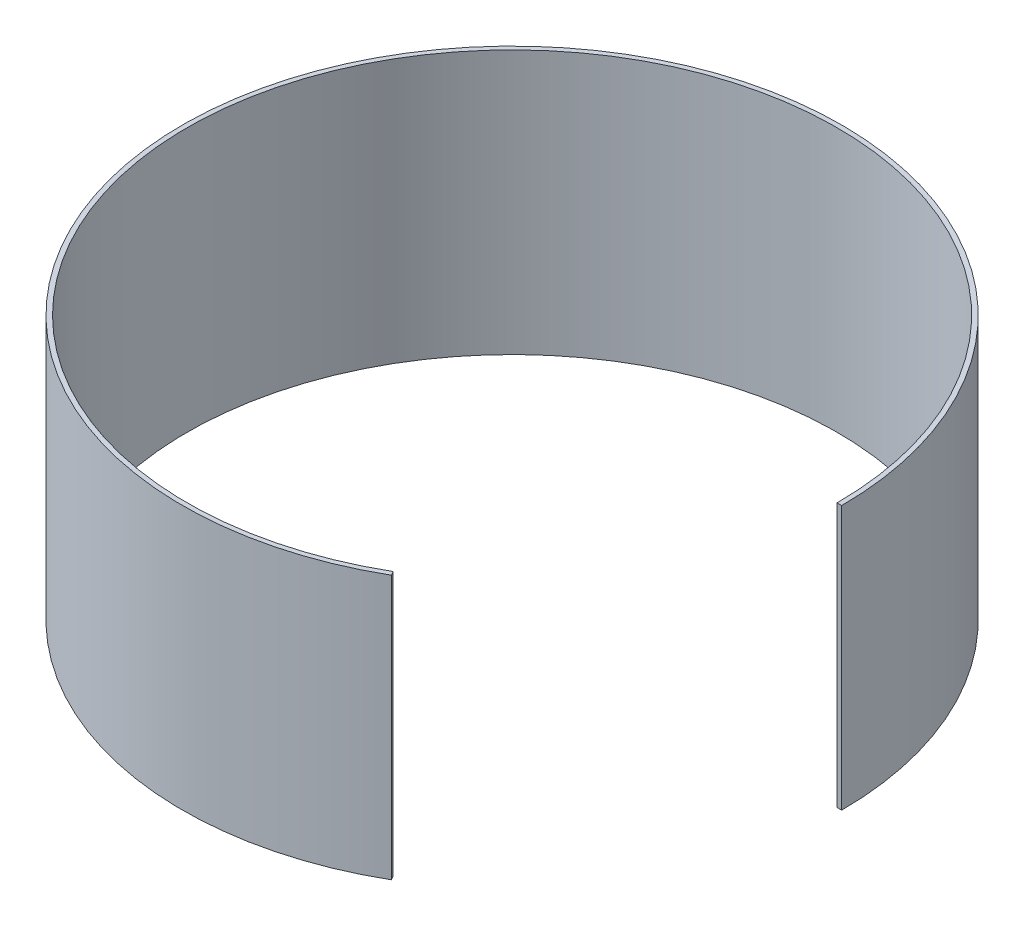
ISO-10303-21;
HEADER;
FILE_DESCRIPTION(('STEP AP214'),'2;1');
FILE_NAME('part.step','',(''),(''),'','','');
FILE_SCHEMA(('AUTOMOTIVE_DESIGN { 1 0 10303 214 1 1 1 1 }'));
ENDSEC;
DATA;
#1=APPLICATION_CONTEXT('core data for automotive mechanical design processes');
#2=APPLICATION_PROTOCOL_DEFINITION('international standard','automotive_design',2000,#1);
#3=PRODUCT_CONTEXT('',#1,'mechanical');
#4=PRODUCT('Part','Part','',(#3));
#5=PRODUCT_RELATED_PRODUCT_CATEGORY('part','',(#4));
#6=PRODUCT_DEFINITION_FORMATION('','',#4);
#7=PRODUCT_DEFINITION_CONTEXT('part definition',#1,'design');
#8=PRODUCT_DEFINITION('design','',#6,#7);
#9=PRODUCT_DEFINITION_SHAPE('','',#8);
#10=(LENGTH_UNIT() NAMED_UNIT(*) SI_UNIT(.MILLI.,.METRE.));
#11=(NAMED_UNIT(*) PLANE_ANGLE_UNIT() SI_UNIT($,.RADIAN.));
#12=(NAMED_UNIT(*) SI_UNIT($,.STERADIAN.) SOLID_ANGLE_UNIT());
#13=UNCERTAINTY_MEASURE_WITH_UNIT(LENGTH_MEASURE(1.E-05),#10,'distance_accuracy_value','');
#14=(GEOMETRIC_REPRESENTATION_CONTEXT(3) GLOBAL_UNCERTAINTY_ASSIGNED_CONTEXT((#13)) GLOBAL_UNIT_ASSIGNED_CONTEXT((#10,
#11,#12)) REPRESENTATION_CONTEXT('',''));
#15=CARTESIAN_POINT('',(0.,0.,0.));
#16=DIRECTION('',(0.,0.,1.));
#17=DIRECTION('',(1.,0.,0.));
#18=AXIS2_PLACEMENT_3D('',#15,#16,#17);
#19=CARTESIAN_POINT('',(0.,0.,0.));
#20=DIRECTION('',(0.,-1.,0.));
#21=DIRECTION('',(0.,0.,-1.));
#22=AXIS2_PLACEMENT_3D('',#19,#20,#21);
#23=CYLINDRICAL_SURFACE('',#22,420.);
#24=CARTESIAN_POINT('',(0.,341.,0.));
#25=DIRECTION('',(0.,-1.,0.));
#26=DIRECTION('',(0.,0.,-1.));
#27=AXIS2_PLACEMENT_3D('',#24,#25,#26);
#28=CIRCLE('',#27,420.);
#29=CARTESIAN_POINT('',(210.000000000004,341.,363.730669589462));
#30=VERTEX_POINT('',#29);
#31=CARTESIAN_POINT('',(420.,341.,0.));
#32=VERTEX_POINT('',#31);
#33=EDGE_CURVE('E11',#30,#32,#28,.T.);
#34=ORIENTED_EDGE('',*,*,#33,.F.);
#35=DIRECTION('',(0.,-1.,0.));
#36=VECTOR('',#35,1.);
#37=CARTESIAN_POINT('',(210.000000000004,341.,363.730669589462));
#38=LINE('',#37,#36);
#39=CARTESIAN_POINT('',(210.000000000004,0.,363.730669589462));
#40=VERTEX_POINT('',#39);
#41=EDGE_CURVE('E73',#30,#40,#38,.T.);
#42=ORIENTED_EDGE('',*,*,#41,.T.);
#43=CARTESIAN_POINT('',(0.,0.,0.));
#44=DIRECTION('',(0.,-1.,0.));
#45=DIRECTION('',(0.,0.,-1.));
#46=AXIS2_PLACEMENT_3D('',#43,#44,#45);
#47=CIRCLE('',#46,420.);
#48=CARTESIAN_POINT('',(420.,0.,0.));
#49=VERTEX_POINT('',#48);
#50=EDGE_CURVE('E68',#40,#49,#47,.T.);
#51=ORIENTED_EDGE('',*,*,#50,.T.);
#52=DIRECTION('',(0.,-1.,0.));
#53=VECTOR('',#52,1.);
#54=CARTESIAN_POINT('',(420.,341.,0.));
#55=LINE('',#54,#53);
#56=EDGE_CURVE('E71',#32,#49,#55,.T.);
#57=ORIENTED_EDGE('',*,*,#56,.F.);
#58=EDGE_LOOP('',(#34,#42,#51,#57));
#59=FACE_BOUND('',#58,.T.);
#60=ADVANCED_FACE('F32',(#59),#23,.F.);
#61=CARTESIAN_POINT('',(213.000000000004,341.,368.926822012168));
#62=DIRECTION('',(0.,1.,0.));
#63=DIRECTION('',(0.,0.,1.));
#64=AXIS2_PLACEMENT_3D('',#61,#62,#63);
#65=PLANE('',#64);
#66=CARTESIAN_POINT('',(0.,341.,0.));
#67=DIRECTION('',(0.,-1.,0.));
#68=DIRECTION('',(0.,0.,-1.));
#69=AXIS2_PLACEMENT_3D('',#66,#67,#68);
#70=CIRCLE('',#69,426.);
#71=CARTESIAN_POINT('',(213.000000000004,341.,368.926822012168));
#72=VERTEX_POINT('',#71);
#73=CARTESIAN_POINT('',(426.,341.,0.));
#74=VERTEX_POINT('',#73);
#75=EDGE_CURVE('E40',#72,#74,#70,.T.);
#76=ORIENTED_EDGE('',*,*,#75,.F.);
#77=DIRECTION('',(-0.50000000000001,0.,-0.866025403784433));
#78=VECTOR('',#77,1.);
#79=CARTESIAN_POINT('',(213.000000000004,341.,368.926822012168));
#80=LINE('',#79,#78);
#81=EDGE_CURVE('E78',#72,#30,#80,.T.);
#82=ORIENTED_EDGE('',*,*,#81,.T.);
#83=ORIENTED_EDGE('',*,*,#33,.T.);
#84=DIRECTION('',(-1.,0.,0.));
#85=VECTOR('',#84,1.);
#86=CARTESIAN_POINT('',(426.,341.,0.));
#87=LINE('',#86,#85);
#88=EDGE_CURVE('E90',#74,#32,#87,.T.);
#89=ORIENTED_EDGE('',*,*,#88,.F.);
#90=EDGE_LOOP('',(#76,#82,#83,#89));
#91=FACE_BOUND('',#90,.T.);
#92=ADVANCED_FACE('F34',(#91),#65,.T.);
#93=CARTESIAN_POINT('',(0.,0.,0.));
#94=DIRECTION('',(0.,-1.,0.));
#95=DIRECTION('',(0.,0.,-1.));
#96=AXIS2_PLACEMENT_3D('',#93,#94,#95);
#97=CYLINDRICAL_SURFACE('',#96,426.);
#98=CARTESIAN_POINT('',(0.,0.,0.));
#99=DIRECTION('',(0.,-1.,0.));
#100=DIRECTION('',(0.,0.,-1.));
#101=AXIS2_PLACEMENT_3D('',#98,#99,#100);
#102=CIRCLE('',#101,426.);
#103=CARTESIAN_POINT('',(213.000000000004,0.,368.926822012168));
#104=VERTEX_POINT('',#103);
#105=CARTESIAN_POINT('',(426.,0.,0.));
#106=VERTEX_POINT('',#105);
#107=EDGE_CURVE('E77',#104,#106,#102,.T.);
#108=ORIENTED_EDGE('',*,*,#107,.F.);
#109=DIRECTION('',(0.,1.,0.));
#110=VECTOR('',#109,1.);
#111=CARTESIAN_POINT('',(213.000000000004,341.,368.926822012168));
#112=LINE('',#111,#110);
#113=EDGE_CURVE('E98',#104,#72,#112,.T.);
#114=ORIENTED_EDGE('',*,*,#113,.T.);
#115=ORIENTED_EDGE('',*,*,#75,.T.);
#116=DIRECTION('',(0.,1.,0.));
#117=VECTOR('',#116,1.);
#118=CARTESIAN_POINT('',(426.,341.,0.));
#119=LINE('',#118,#117);
#120=EDGE_CURVE('E86',#106,#74,#119,.T.);
#121=ORIENTED_EDGE('',*,*,#120,.F.);
#122=EDGE_LOOP('',(#108,#114,#115,#121));
#123=FACE_BOUND('',#122,.T.);
#124=ADVANCED_FACE('F102',(#123),#97,.T.);
#125=CARTESIAN_POINT('',(213.000000000004,0.,368.926822012168));
#126=DIRECTION('',(0.,-1.,0.));
#127=DIRECTION('',(0.,0.,-1.));
#128=AXIS2_PLACEMENT_3D('',#125,#126,#127);
#129=PLANE('',#128);
#130=DIRECTION('',(0.50000000000001,0.,0.866025403784433));
#131=VECTOR('',#130,1.);
#132=CARTESIAN_POINT('',(213.000000000004,0.,368.926822012168));
#133=LINE('',#132,#131);
#134=EDGE_CURVE('E96',#40,#104,#133,.T.);
#135=ORIENTED_EDGE('',*,*,#134,.T.);
#136=ORIENTED_EDGE('',*,*,#107,.T.);
#137=DIRECTION('',(1.,0.,0.));
#138=VECTOR('',#137,1.);
#139=CARTESIAN_POINT('',(426.,0.,0.));
#140=LINE('',#139,#138);
#141=EDGE_CURVE('E81',#49,#106,#140,.T.);
#142=ORIENTED_EDGE('',*,*,#141,.F.);
#143=ORIENTED_EDGE('',*,*,#50,.F.);
#144=EDGE_LOOP('',(#135,#136,#142,#143));
#145=FACE_BOUND('',#144,.T.);
#146=ADVANCED_FACE('F82',(#145),#129,.T.);
#147=CARTESIAN_POINT('',(0.,0.,0.));
#148=DIRECTION('',(0.866025403784433,0.,-0.50000000000001));
#149=DIRECTION('',(-0.50000000000001,0.,-0.866025403784433));
#150=AXIS2_PLACEMENT_3D('',#147,#148,#149);
#151=PLANE('',#150);
#152=ORIENTED_EDGE('',*,*,#41,.F.);
#153=ORIENTED_EDGE('',*,*,#81,.F.);
#154=ORIENTED_EDGE('',*,*,#113,.F.);
#155=ORIENTED_EDGE('',*,*,#134,.F.);
#156=EDGE_LOOP('',(#152,#153,#154,#155));
#157=FACE_BOUND('',#156,.T.);
#158=ADVANCED_FACE('F106',(#157),#151,.T.);
#159=CARTESIAN_POINT('',(0.,0.,0.));
#160=DIRECTION('',(0.,0.,-1.));
#161=DIRECTION('',(-1.,0.,0.));
#162=AXIS2_PLACEMENT_3D('',#159,#160,#161);
#163=PLANE('',#162);
#164=ORIENTED_EDGE('',*,*,#56,.T.);
#165=ORIENTED_EDGE('',*,*,#141,.T.);
#166=ORIENTED_EDGE('',*,*,#120,.T.);
#167=ORIENTED_EDGE('',*,*,#88,.T.);
#168=EDGE_LOOP('',(#164,#165,#166,#167));
#169=FACE_BOUND('',#168,.T.);
#170=ADVANCED_FACE('F89',(#169),#163,.F.);
#171=CLOSED_SHELL('',(#60,#92,#124,#146,#158,#170));
#172=MANIFOLD_SOLID_BREP('B2',#171);
#173=ADVANCED_BREP_SHAPE_REPRESENTATION('',(#18,#172),#14);
#174=SHAPE_DEFINITION_REPRESENTATION(#9,#173);
ENDSEC;
END-ISO-10303-21;
